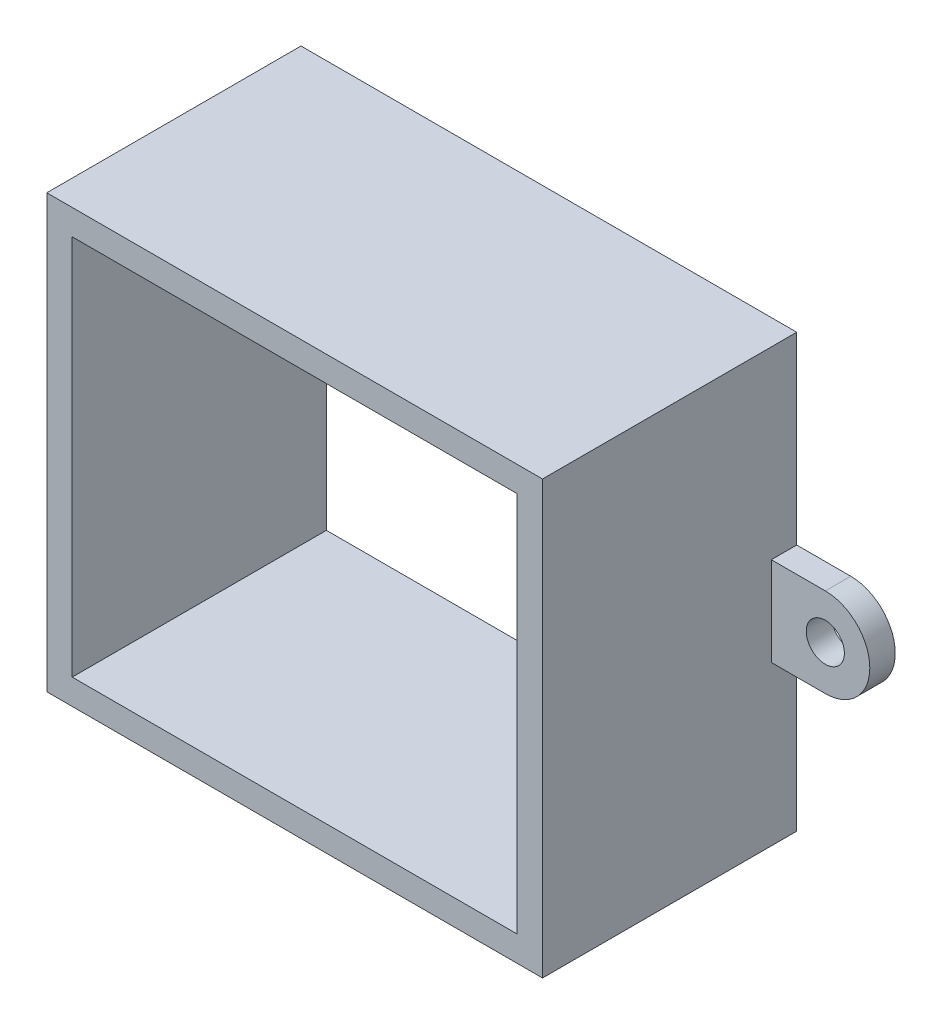
ISO-10303-21;
HEADER;
FILE_DESCRIPTION(('STEP AP214'),'2;1');
FILE_NAME('part.step','',(''),(''),'','','');
FILE_SCHEMA(('AUTOMOTIVE_DESIGN { 1 0 10303 214 1 1 1 1 }'));
ENDSEC;
DATA;
#1=APPLICATION_CONTEXT('core data for automotive mechanical design processes');
#2=APPLICATION_PROTOCOL_DEFINITION('international standard','automotive_design',2000,#1);
#3=PRODUCT_CONTEXT('',#1,'mechanical');
#4=PRODUCT('Part','Part','',(#3));
#5=PRODUCT_RELATED_PRODUCT_CATEGORY('part','',(#4));
#6=PRODUCT_DEFINITION_FORMATION('','',#4);
#7=PRODUCT_DEFINITION_CONTEXT('part definition',#1,'design');
#8=PRODUCT_DEFINITION('design','',#6,#7);
#9=PRODUCT_DEFINITION_SHAPE('','',#8);
#10=(LENGTH_UNIT() NAMED_UNIT(*) SI_UNIT(.MILLI.,.METRE.));
#11=(NAMED_UNIT(*) PLANE_ANGLE_UNIT() SI_UNIT($,.RADIAN.));
#12=(NAMED_UNIT(*) SI_UNIT($,.STERADIAN.) SOLID_ANGLE_UNIT());
#13=UNCERTAINTY_MEASURE_WITH_UNIT(LENGTH_MEASURE(1.E-05),#10,'distance_accuracy_value','');
#14=(GEOMETRIC_REPRESENTATION_CONTEXT(3) GLOBAL_UNCERTAINTY_ASSIGNED_CONTEXT((#13)) GLOBAL_UNIT_ASSIGNED_CONTEXT((#10,
#11,#12)) REPRESENTATION_CONTEXT('',''));
#15=CARTESIAN_POINT('',(0.,0.,0.));
#16=DIRECTION('',(0.,0.,1.));
#17=DIRECTION('',(1.,0.,0.));
#18=AXIS2_PLACEMENT_3D('',#15,#16,#17);
#19=CARTESIAN_POINT('',(-2.,-31.0544624151342,20.));
#20=DIRECTION('',(1.,0.,0.));
#21=DIRECTION('',(0.,0.,-1.));
#22=AXIS2_PLACEMENT_3D('',#19,#20,#21);
#23=PLANE('',#22);
#24=DIRECTION('',(0.,0.,-1.));
#25=VECTOR('',#24,1.);
#26=CARTESIAN_POINT('',(-2.,17.5,2.));
#27=LINE('',#26,#25);
#28=CARTESIAN_POINT('',(-2.,17.5,2.));
#29=VERTEX_POINT('',#28);
#30=CARTESIAN_POINT('',(-2.,17.5,0.));
#31=VERTEX_POINT('',#30);
#32=EDGE_CURVE('E341',#29,#31,#27,.T.);
#33=ORIENTED_EDGE('',*,*,#32,.F.);
#34=DIRECTION('',(0.,1.,0.));
#35=VECTOR('',#34,1.);
#36=CARTESIAN_POINT('',(-1.99999999999998,-31.0544624151342,2.));
#37=LINE('',#36,#35);
#38=CARTESIAN_POINT('',(-2.,10.5,2.));
#39=VERTEX_POINT('',#38);
#40=EDGE_CURVE('E527',#39,#29,#37,.T.);
#41=ORIENTED_EDGE('',*,*,#40,.F.);
#42=DIRECTION('',(0.,0.,-1.));
#43=VECTOR('',#42,1.);
#44=CARTESIAN_POINT('',(-2.,10.5,2.));
#45=LINE('',#44,#43);
#46=CARTESIAN_POINT('',(-2.,10.5,0.));
#47=VERTEX_POINT('',#46);
#48=EDGE_CURVE('E542',#39,#47,#45,.T.);
#49=ORIENTED_EDGE('',*,*,#48,.T.);
#50=DIRECTION('',(0.,-1.,0.));
#51=VECTOR('',#50,1.);
#52=CARTESIAN_POINT('',(-2.,-31.0544624151342,0.));
#53=LINE('',#52,#51);
#54=CARTESIAN_POINT('',(-1.99999999999999,-2.,0.));
#55=VERTEX_POINT('',#54);
#56=EDGE_CURVE('E215',#47,#55,#53,.T.);
#57=ORIENTED_EDGE('',*,*,#56,.T.);
#58=DIRECTION('',(0.,0.,-1.));
#59=VECTOR('',#58,1.);
#60=CARTESIAN_POINT('',(-1.99999999999999,-2.,20.));
#61=LINE('',#60,#59);
#62=CARTESIAN_POINT('',(-1.99999999999999,-2.,20.));
#63=VERTEX_POINT('',#62);
#64=EDGE_CURVE('E239',#63,#55,#61,.T.);
#65=ORIENTED_EDGE('',*,*,#64,.F.);
#66=DIRECTION('',(0.,-1.,0.));
#67=VECTOR('',#66,1.);
#68=CARTESIAN_POINT('',(-2.,-31.0544624151342,20.));
#69=LINE('',#68,#67);
#70=CARTESIAN_POINT('',(-2.,32.,20.));
#71=VERTEX_POINT('',#70);
#72=EDGE_CURVE('E275',#71,#63,#69,.T.);
#73=ORIENTED_EDGE('',*,*,#72,.F.);
#74=DIRECTION('',(0.,0.,-1.));
#75=VECTOR('',#74,1.);
#76=CARTESIAN_POINT('',(-2.,32.,20.));
#77=LINE('',#76,#75);
#78=CARTESIAN_POINT('',(-2.,32.,0.));
#79=VERTEX_POINT('',#78);
#80=EDGE_CURVE('E44',#71,#79,#77,.T.);
#81=ORIENTED_EDGE('',*,*,#80,.T.);
#82=EDGE_CURVE('E224',#79,#31,#53,.T.);
#83=ORIENTED_EDGE('',*,*,#82,.T.);
#84=EDGE_LOOP('',(#33,#41,#49,#57,#65,#73,#81,#83));
#85=FACE_BOUND('',#84,.T.);
#86=ADVANCED_FACE('F35',(#85),#23,.F.);
#87=CARTESIAN_POINT('',(37.,-31.0544624151342,20.));
#88=DIRECTION('',(1.,0.,0.));
#89=DIRECTION('',(0.,0.,-1.));
#90=AXIS2_PLACEMENT_3D('',#87,#88,#89);
#91=PLANE('',#90);
#92=DIRECTION('',(0.,0.,-1.));
#93=VECTOR('',#92,1.);
#94=CARTESIAN_POINT('',(37.,10.5,2.));
#95=LINE('',#94,#93);
#96=CARTESIAN_POINT('',(37.,10.5,2.));
#97=VERTEX_POINT('',#96);
#98=CARTESIAN_POINT('',(37.,10.5,0.));
#99=VERTEX_POINT('',#98);
#100=EDGE_CURVE('E186',#97,#99,#95,.T.);
#101=ORIENTED_EDGE('',*,*,#100,.F.);
#102=DIRECTION('',(0.,1.,0.));
#103=VECTOR('',#102,1.);
#104=CARTESIAN_POINT('',(37.,-31.0544624151341,2.));
#105=LINE('',#104,#103);
#106=CARTESIAN_POINT('',(37.,17.5,2.));
#107=VERTEX_POINT('',#106);
#108=EDGE_CURVE('E166',#97,#107,#105,.T.);
#109=ORIENTED_EDGE('',*,*,#108,.T.);
#110=DIRECTION('',(0.,0.,-1.));
#111=VECTOR('',#110,1.);
#112=CARTESIAN_POINT('',(37.,17.5,2.));
#113=LINE('',#112,#111);
#114=CARTESIAN_POINT('',(37.,17.5,0.));
#115=VERTEX_POINT('',#114);
#116=EDGE_CURVE('E160',#107,#115,#113,.T.);
#117=ORIENTED_EDGE('',*,*,#116,.T.);
#118=DIRECTION('',(0.,-1.,0.));
#119=VECTOR('',#118,1.);
#120=CARTESIAN_POINT('',(37.,-31.0544624151342,0.));
#121=LINE('',#120,#119);
#122=CARTESIAN_POINT('',(37.,32.,0.));
#123=VERTEX_POINT('',#122);
#124=EDGE_CURVE('E204',#123,#115,#121,.T.);
#125=ORIENTED_EDGE('',*,*,#124,.F.);
#126=DIRECTION('',(0.,0.,-1.));
#127=VECTOR('',#126,1.);
#128=CARTESIAN_POINT('',(37.,32.,20.));
#129=LINE('',#128,#127);
#130=CARTESIAN_POINT('',(37.,32.,20.));
#131=VERTEX_POINT('',#130);
#132=EDGE_CURVE('E11',#131,#123,#129,.T.);
#133=ORIENTED_EDGE('',*,*,#132,.F.);
#134=DIRECTION('',(0.,-1.,0.));
#135=VECTOR('',#134,1.);
#136=CARTESIAN_POINT('',(37.,-31.0544624151342,20.));
#137=LINE('',#136,#135);
#138=CARTESIAN_POINT('',(37.,-2.,20.));
#139=VERTEX_POINT('',#138);
#140=EDGE_CURVE('E249',#131,#139,#137,.T.);
#141=ORIENTED_EDGE('',*,*,#140,.T.);
#142=DIRECTION('',(0.,0.,-1.));
#143=VECTOR('',#142,1.);
#144=CARTESIAN_POINT('',(37.,-2.,20.));
#145=LINE('',#144,#143);
#146=CARTESIAN_POINT('',(37.,-2.,0.));
#147=VERTEX_POINT('',#146);
#148=EDGE_CURVE('E229',#139,#147,#145,.T.);
#149=ORIENTED_EDGE('',*,*,#148,.T.);
#150=EDGE_CURVE('E201',#99,#147,#121,.T.);
#151=ORIENTED_EDGE('',*,*,#150,.F.);
#152=EDGE_LOOP('',(#101,#109,#117,#125,#133,#141,#149,#151));
#153=FACE_BOUND('',#152,.T.);
#154=ADVANCED_FACE('F247',(#153),#91,.T.);
#155=CARTESIAN_POINT('',(17.4977780039393,32.,20.));
#156=DIRECTION('',(0.,1.,0.));
#157=DIRECTION('',(0.,0.,1.));
#158=AXIS2_PLACEMENT_3D('',#155,#156,#157);
#159=PLANE('',#158);
#160=DIRECTION('',(1.,0.,0.));
#161=VECTOR('',#160,1.);
#162=CARTESIAN_POINT('',(17.4977780039393,32.,0.));
#163=LINE('',#162,#161);
#164=EDGE_CURVE('E211',#79,#123,#163,.T.);
#165=ORIENTED_EDGE('',*,*,#164,.F.);
#166=ORIENTED_EDGE('',*,*,#80,.F.);
#167=DIRECTION('',(1.,0.,0.));
#168=VECTOR('',#167,1.);
#169=CARTESIAN_POINT('',(17.4977780039393,32.,20.));
#170=LINE('',#169,#168);
#171=EDGE_CURVE('E272',#71,#131,#170,.T.);
#172=ORIENTED_EDGE('',*,*,#171,.T.);
#173=ORIENTED_EDGE('',*,*,#132,.T.);
#174=EDGE_LOOP('',(#165,#166,#172,#173));
#175=FACE_BOUND('',#174,.T.);
#176=ADVANCED_FACE('F319',(#175),#159,.T.);
#177=CARTESIAN_POINT('',(35.,-31.0544624151342,20.));
#178=DIRECTION('',(-1.,0.,0.));
#179=DIRECTION('',(0.,0.,1.));
#180=AXIS2_PLACEMENT_3D('',#177,#178,#179);
#181=PLANE('',#180);
#182=DIRECTION('',(0.,1.,0.));
#183=VECTOR('',#182,1.);
#184=CARTESIAN_POINT('',(35.,-31.0544624151342,0.));
#185=LINE('',#184,#183);
#186=CARTESIAN_POINT('',(35.,0.,0.));
#187=VERTEX_POINT('',#186);
#188=CARTESIAN_POINT('',(35.,30.,0.));
#189=VERTEX_POINT('',#188);
#190=EDGE_CURVE('E279',#187,#189,#185,.T.);
#191=ORIENTED_EDGE('',*,*,#190,.F.);
#192=DIRECTION('',(0.,0.,-1.));
#193=VECTOR('',#192,1.);
#194=CARTESIAN_POINT('',(35.,0.,20.));
#195=LINE('',#194,#193);
#196=CARTESIAN_POINT('',(35.,0.,20.));
#197=VERTEX_POINT('',#196);
#198=EDGE_CURVE('E227',#197,#187,#195,.T.);
#199=ORIENTED_EDGE('',*,*,#198,.F.);
#200=DIRECTION('',(0.,1.,0.));
#201=VECTOR('',#200,1.);
#202=CARTESIAN_POINT('',(35.,-31.0544624151342,20.));
#203=LINE('',#202,#201);
#204=CARTESIAN_POINT('',(35.,30.,20.));
#205=VERTEX_POINT('',#204);
#206=EDGE_CURVE('E255',#197,#205,#203,.T.);
#207=ORIENTED_EDGE('',*,*,#206,.T.);
#208=DIRECTION('',(0.,0.,-1.));
#209=VECTOR('',#208,1.);
#210=CARTESIAN_POINT('',(35.,30.,20.));
#211=LINE('',#210,#209);
#212=EDGE_CURVE('E235',#205,#189,#211,.T.);
#213=ORIENTED_EDGE('',*,*,#212,.T.);
#214=EDGE_LOOP('',(#191,#199,#207,#213));
#215=FACE_BOUND('',#214,.T.);
#216=ADVANCED_FACE('F37',(#215),#181,.T.);
#217=CARTESIAN_POINT('',(17.4977780039393,0.,20.));
#218=DIRECTION('',(0.,1.,0.));
#219=DIRECTION('',(0.,0.,1.));
#220=AXIS2_PLACEMENT_3D('',#217,#218,#219);
#221=PLANE('',#220);
#222=DIRECTION('',(1.,0.,0.));
#223=VECTOR('',#222,1.);
#224=CARTESIAN_POINT('',(17.4977780039393,0.,0.));
#225=LINE('',#224,#223);
#226=CARTESIAN_POINT('',(0.,0.,0.));
#227=VERTEX_POINT('',#226);
#228=EDGE_CURVE('E282',#227,#187,#225,.T.);
#229=ORIENTED_EDGE('',*,*,#228,.F.);
#230=DIRECTION('',(0.,0.,-1.));
#231=VECTOR('',#230,1.);
#232=CARTESIAN_POINT('',(0.,0.,20.));
#233=LINE('',#232,#231);
#234=CARTESIAN_POINT('',(0.,0.,20.));
#235=VERTEX_POINT('',#234);
#236=EDGE_CURVE('E230',#235,#227,#233,.T.);
#237=ORIENTED_EDGE('',*,*,#236,.F.);
#238=DIRECTION('',(1.,0.,0.));
#239=VECTOR('',#238,1.);
#240=CARTESIAN_POINT('',(17.4977780039393,0.,20.));
#241=LINE('',#240,#239);
#242=EDGE_CURVE('E257',#235,#197,#241,.T.);
#243=ORIENTED_EDGE('',*,*,#242,.T.);
#244=ORIENTED_EDGE('',*,*,#198,.T.);
#245=EDGE_LOOP('',(#229,#237,#243,#244));
#246=FACE_BOUND('',#245,.T.);
#247=ADVANCED_FACE('F303',(#246),#221,.T.);
#248=CARTESIAN_POINT('',(0.,-31.0544624151342,20.));
#249=DIRECTION('',(-1.,0.,0.));
#250=DIRECTION('',(0.,-1.,0.));
#251=AXIS2_PLACEMENT_3D('',#248,#249,#250);
#252=PLANE('',#251);
#253=DIRECTION('',(0.,1.,0.));
#254=VECTOR('',#253,1.);
#255=CARTESIAN_POINT('',(0.,-31.0544624151342,0.));
#256=LINE('',#255,#254);
#257=CARTESIAN_POINT('',(0.,30.,0.));
#258=VERTEX_POINT('',#257);
#259=EDGE_CURVE('E284',#227,#258,#256,.T.);
#260=ORIENTED_EDGE('',*,*,#259,.T.);
#261=DIRECTION('',(0.,0.,-1.));
#262=VECTOR('',#261,1.);
#263=CARTESIAN_POINT('',(0.,30.,20.));
#264=LINE('',#263,#262);
#265=CARTESIAN_POINT('',(0.,30.,20.));
#266=VERTEX_POINT('',#265);
#267=EDGE_CURVE('E232',#266,#258,#264,.T.);
#268=ORIENTED_EDGE('',*,*,#267,.F.);
#269=DIRECTION('',(0.,1.,0.));
#270=VECTOR('',#269,1.);
#271=CARTESIAN_POINT('',(0.,-31.0544624151342,20.));
#272=LINE('',#271,#270);
#273=EDGE_CURVE('E262',#235,#266,#272,.T.);
#274=ORIENTED_EDGE('',*,*,#273,.F.);
#275=ORIENTED_EDGE('',*,*,#236,.T.);
#276=EDGE_LOOP('',(#260,#268,#274,#275));
#277=FACE_BOUND('',#276,.T.);
#278=ADVANCED_FACE('F305',(#277),#252,.F.);
#279=CARTESIAN_POINT('',(17.4977780039393,30.,20.));
#280=DIRECTION('',(0.,1.,0.));
#281=DIRECTION('',(0.,0.,1.));
#282=AXIS2_PLACEMENT_3D('',#279,#280,#281);
#283=PLANE('',#282);
#284=DIRECTION('',(1.,0.,0.));
#285=VECTOR('',#284,1.);
#286=CARTESIAN_POINT('',(17.4977780039393,30.,0.));
#287=LINE('',#286,#285);
#288=EDGE_CURVE('E205',#258,#189,#287,.T.);
#289=ORIENTED_EDGE('',*,*,#288,.T.);
#290=ORIENTED_EDGE('',*,*,#212,.F.);
#291=DIRECTION('',(1.,0.,0.));
#292=VECTOR('',#291,1.);
#293=CARTESIAN_POINT('',(17.4977780039393,30.,20.));
#294=LINE('',#293,#292);
#295=EDGE_CURVE('E269',#266,#205,#294,.T.);
#296=ORIENTED_EDGE('',*,*,#295,.F.);
#297=ORIENTED_EDGE('',*,*,#267,.T.);
#298=EDGE_LOOP('',(#289,#290,#296,#297));
#299=FACE_BOUND('',#298,.T.);
#300=ADVANCED_FACE('F292',(#299),#283,.F.);
#301=CARTESIAN_POINT('',(17.4977780039393,-2.,20.));
#302=DIRECTION('',(0.,1.,0.));
#303=DIRECTION('',(0.,0.,1.));
#304=AXIS2_PLACEMENT_3D('',#301,#302,#303);
#305=PLANE('',#304);
#306=DIRECTION('',(1.,0.,0.));
#307=VECTOR('',#306,1.);
#308=CARTESIAN_POINT('',(17.4977780039393,-2.,0.));
#309=LINE('',#308,#307);
#310=EDGE_CURVE('E218',#55,#147,#309,.T.);
#311=ORIENTED_EDGE('',*,*,#310,.T.);
#312=ORIENTED_EDGE('',*,*,#148,.F.);
#313=DIRECTION('',(1.,0.,0.));
#314=VECTOR('',#313,1.);
#315=CARTESIAN_POINT('',(17.4977780039393,-2.,20.));
#316=LINE('',#315,#314);
#317=EDGE_CURVE('E236',#63,#139,#316,.T.);
#318=ORIENTED_EDGE('',*,*,#317,.F.);
#319=ORIENTED_EDGE('',*,*,#64,.T.);
#320=EDGE_LOOP('',(#311,#312,#318,#319));
#321=FACE_BOUND('',#320,.T.);
#322=ADVANCED_FACE('F252',(#321),#305,.F.);
#323=CARTESIAN_POINT('',(17.4977780039393,-31.0544624151342,20.));
#324=DIRECTION('',(0.,0.,1.));
#325=DIRECTION('',(1.,0.,0.));
#326=AXIS2_PLACEMENT_3D('',#323,#324,#325);
#327=PLANE('',#326);
#328=ORIENTED_EDGE('',*,*,#206,.F.);
#329=ORIENTED_EDGE('',*,*,#242,.F.);
#330=ORIENTED_EDGE('',*,*,#273,.T.);
#331=ORIENTED_EDGE('',*,*,#295,.T.);
#332=EDGE_LOOP('',(#328,#329,#330,#331));
#333=FACE_BOUND('',#332,.T.);
#334=ORIENTED_EDGE('',*,*,#140,.F.);
#335=ORIENTED_EDGE('',*,*,#171,.F.);
#336=ORIENTED_EDGE('',*,*,#72,.T.);
#337=ORIENTED_EDGE('',*,*,#317,.T.);
#338=EDGE_LOOP('',(#334,#335,#336,#337));
#339=FACE_BOUND('',#338,.T.);
#340=ADVANCED_FACE('F301',(#333,#339),#327,.T.);
#341=CARTESIAN_POINT('',(17.4977780039393,-31.0544624151342,0.));
#342=DIRECTION('',(0.,0.,1.));
#343=DIRECTION('',(1.,0.,0.));
#344=AXIS2_PLACEMENT_3D('',#341,#342,#343);
#345=PLANE('',#344);
#346=ORIENTED_EDGE('',*,*,#190,.T.);
#347=ORIENTED_EDGE('',*,*,#288,.F.);
#348=ORIENTED_EDGE('',*,*,#259,.F.);
#349=ORIENTED_EDGE('',*,*,#228,.T.);
#350=EDGE_LOOP('',(#346,#347,#348,#349));
#351=FACE_BOUND('',#350,.T.);
#352=ORIENTED_EDGE('',*,*,#124,.T.);
#353=DIRECTION('',(-1.,0.,0.));
#354=VECTOR('',#353,1.);
#355=CARTESIAN_POINT('',(17.4977780039394,17.5,0.));
#356=LINE('',#355,#354);
#357=CARTESIAN_POINT('',(41.25,17.5,0.));
#358=VERTEX_POINT('',#357);
#359=EDGE_CURVE('E52',#358,#115,#356,.T.);
#360=ORIENTED_EDGE('',*,*,#359,.F.);
#361=CARTESIAN_POINT('',(41.25,14.,0.));
#362=DIRECTION('',(0.,0.,1.));
#363=DIRECTION('',(1.,0.,0.));
#364=AXIS2_PLACEMENT_3D('',#361,#362,#363);
#365=CIRCLE('',#364,3.5);
#366=CARTESIAN_POINT('',(41.25,10.5,0.));
#367=VERTEX_POINT('',#366);
#368=EDGE_CURVE('E158',#358,#367,#365,.F.);
#369=ORIENTED_EDGE('',*,*,#368,.T.);
#370=DIRECTION('',(-1.,0.,0.));
#371=VECTOR('',#370,1.);
#372=CARTESIAN_POINT('',(17.4977780039394,10.5,0.));
#373=LINE('',#372,#371);
#374=EDGE_CURVE('E175',#367,#99,#373,.T.);
#375=ORIENTED_EDGE('',*,*,#374,.T.);
#376=ORIENTED_EDGE('',*,*,#150,.T.);
#377=ORIENTED_EDGE('',*,*,#310,.F.);
#378=ORIENTED_EDGE('',*,*,#56,.F.);
#379=DIRECTION('',(1.,0.,0.));
#380=VECTOR('',#379,1.);
#381=CARTESIAN_POINT('',(17.4977780039393,10.5,0.));
#382=LINE('',#381,#380);
#383=CARTESIAN_POINT('',(-6.25,10.5,0.));
#384=VERTEX_POINT('',#383);
#385=EDGE_CURVE('E60',#384,#47,#382,.T.);
#386=ORIENTED_EDGE('',*,*,#385,.F.);
#387=CARTESIAN_POINT('',(-6.25000000000001,14.,0.));
#388=DIRECTION('',(0.,0.,1.));
#389=DIRECTION('',(1.,0.,0.));
#390=AXIS2_PLACEMENT_3D('',#387,#388,#389);
#391=CIRCLE('',#390,3.5);
#392=CARTESIAN_POINT('',(-6.25000000000001,17.5,0.));
#393=VERTEX_POINT('',#392);
#394=EDGE_CURVE('E536',#393,#384,#391,.T.);
#395=ORIENTED_EDGE('',*,*,#394,.F.);
#396=DIRECTION('',(1.,0.,0.));
#397=VECTOR('',#396,1.);
#398=CARTESIAN_POINT('',(17.4977780039393,17.5,0.));
#399=LINE('',#398,#397);
#400=EDGE_CURVE('E339',#393,#31,#399,.T.);
#401=ORIENTED_EDGE('',*,*,#400,.T.);
#402=ORIENTED_EDGE('',*,*,#82,.F.);
#403=ORIENTED_EDGE('',*,*,#164,.T.);
#404=EDGE_LOOP('',(#352,#360,#369,#375,#376,#377,#378,#386,#395,#401,#402,#403));
#405=FACE_BOUND('',#404,.T.);
#406=CARTESIAN_POINT('',(-6.25000000000001,14.,0.));
#407=DIRECTION('',(0.,0.,1.));
#408=DIRECTION('',(1.,0.,0.));
#409=AXIS2_PLACEMENT_3D('',#406,#407,#408);
#410=CIRCLE('',#409,1.5);
#411=CARTESIAN_POINT('',(-4.75000000000001,14.,0.));
#412=VERTEX_POINT('',#411);
#413=EDGE_CURVE('E159',#412,#412,#410,.T.);
#414=ORIENTED_EDGE('',*,*,#413,.T.);
#415=EDGE_LOOP('',(#414));
#416=FACE_BOUND('',#415,.T.);
#417=CARTESIAN_POINT('',(41.25,14.,0.));
#418=DIRECTION('',(0.,0.,1.));
#419=DIRECTION('',(1.,0.,0.));
#420=AXIS2_PLACEMENT_3D('',#417,#418,#419);
#421=CIRCLE('',#420,1.5);
#422=CARTESIAN_POINT('',(42.75,14.,0.));
#423=VERTEX_POINT('',#422);
#424=EDGE_CURVE('E172',#423,#423,#421,.F.);
#425=ORIENTED_EDGE('',*,*,#424,.F.);
#426=EDGE_LOOP('',(#425));
#427=FACE_BOUND('',#426,.T.);
#428=ADVANCED_FACE('F296',(#351,#405,#416,#427),#345,.F.);
#429=CARTESIAN_POINT('',(17.4977780039393,17.5,2.));
#430=DIRECTION('',(0.,1.,0.));
#431=DIRECTION('',(-1.,0.,0.));
#432=AXIS2_PLACEMENT_3D('',#429,#430,#431);
#433=PLANE('',#432);
#434=ORIENTED_EDGE('',*,*,#400,.F.);
#435=DIRECTION('',(0.,0.,-1.));
#436=VECTOR('',#435,1.);
#437=CARTESIAN_POINT('',(-6.25000000000001,17.5,2.));
#438=LINE('',#437,#436);
#439=CARTESIAN_POINT('',(-6.25000000000001,17.5,2.));
#440=VERTEX_POINT('',#439);
#441=EDGE_CURVE('E265',#440,#393,#438,.T.);
#442=ORIENTED_EDGE('',*,*,#441,.F.);
#443=DIRECTION('',(1.,0.,0.));
#444=VECTOR('',#443,1.);
#445=CARTESIAN_POINT('',(17.4977780039393,17.5,2.));
#446=LINE('',#445,#444);
#447=EDGE_CURVE('E523',#440,#29,#446,.T.);
#448=ORIENTED_EDGE('',*,*,#447,.T.);
#449=ORIENTED_EDGE('',*,*,#32,.T.);
#450=EDGE_LOOP('',(#434,#442,#448,#449));
#451=FACE_BOUND('',#450,.T.);
#452=ADVANCED_FACE('F349',(#451),#433,.T.);
#453=CARTESIAN_POINT('',(-6.25000000000001,14.,2.));
#454=DIRECTION('',(0.,0.,-1.));
#455=DIRECTION('',(-1.,0.,0.));
#456=AXIS2_PLACEMENT_3D('',#453,#454,#455);
#457=CYLINDRICAL_SURFACE('',#456,3.5);
#458=ORIENTED_EDGE('',*,*,#394,.T.);
#459=DIRECTION('',(0.,0.,-1.));
#460=VECTOR('',#459,1.);
#461=CARTESIAN_POINT('',(-6.25,10.5,2.));
#462=LINE('',#461,#460);
#463=CARTESIAN_POINT('',(-6.25,10.5,2.));
#464=VERTEX_POINT('',#463);
#465=EDGE_CURVE('E540',#464,#384,#462,.T.);
#466=ORIENTED_EDGE('',*,*,#465,.F.);
#467=CARTESIAN_POINT('',(-6.25000000000001,14.,2.));
#468=DIRECTION('',(0.,0.,1.));
#469=DIRECTION('',(1.,0.,0.));
#470=AXIS2_PLACEMENT_3D('',#467,#468,#469);
#471=CIRCLE('',#470,3.5);
#472=EDGE_CURVE('E525',#440,#464,#471,.T.);
#473=ORIENTED_EDGE('',*,*,#472,.F.);
#474=ORIENTED_EDGE('',*,*,#441,.T.);
#475=EDGE_LOOP('',(#458,#466,#473,#474));
#476=FACE_BOUND('',#475,.T.);
#477=ADVANCED_FACE('F359',(#476),#457,.T.);
#478=CARTESIAN_POINT('',(17.4977780039393,10.5,2.));
#479=DIRECTION('',(0.,1.,0.));
#480=DIRECTION('',(-1.,0.,0.));
#481=AXIS2_PLACEMENT_3D('',#478,#479,#480);
#482=PLANE('',#481);
#483=ORIENTED_EDGE('',*,*,#385,.T.);
#484=ORIENTED_EDGE('',*,*,#48,.F.);
#485=DIRECTION('',(1.,0.,0.));
#486=VECTOR('',#485,1.);
#487=CARTESIAN_POINT('',(17.4977780039393,10.5,2.));
#488=LINE('',#487,#486);
#489=EDGE_CURVE('E529',#464,#39,#488,.T.);
#490=ORIENTED_EDGE('',*,*,#489,.F.);
#491=ORIENTED_EDGE('',*,*,#465,.T.);
#492=EDGE_LOOP('',(#483,#484,#490,#491));
#493=FACE_BOUND('',#492,.T.);
#494=ADVANCED_FACE('F355',(#493),#482,.F.);
#495=CARTESIAN_POINT('',(-6.25000000000001,14.,2.));
#496=DIRECTION('',(0.,0.,-1.));
#497=DIRECTION('',(-1.,0.,0.));
#498=AXIS2_PLACEMENT_3D('',#495,#496,#497);
#499=CYLINDRICAL_SURFACE('',#498,1.5);
#500=CARTESIAN_POINT('',(-6.25000000000001,14.,2.));
#501=DIRECTION('',(0.,0.,1.));
#502=DIRECTION('',(1.,0.,0.));
#503=AXIS2_PLACEMENT_3D('',#500,#501,#502);
#504=CIRCLE('',#503,1.5);
#505=CARTESIAN_POINT('',(-4.75000000000001,14.,2.));
#506=VERTEX_POINT('',#505);
#507=EDGE_CURVE('E519',#506,#506,#504,.T.);
#508=ORIENTED_EDGE('',*,*,#507,.T.);
#509=EDGE_LOOP('',(#508));
#510=FACE_BOUND('',#509,.T.);
#511=ORIENTED_EDGE('',*,*,#413,.F.);
#512=EDGE_LOOP('',(#511));
#513=FACE_BOUND('',#512,.T.);
#514=ADVANCED_FACE('F351',(#510,#513),#499,.F.);
#515=CARTESIAN_POINT('',(17.4977780039393,-31.0544624151342,2.));
#516=DIRECTION('',(0.,0.,1.));
#517=DIRECTION('',(1.,0.,0.));
#518=AXIS2_PLACEMENT_3D('',#515,#516,#517);
#519=PLANE('',#518);
#520=ORIENTED_EDGE('',*,*,#507,.F.);
#521=EDGE_LOOP('',(#520));
#522=FACE_BOUND('',#521,.T.);
#523=ORIENTED_EDGE('',*,*,#447,.F.);
#524=ORIENTED_EDGE('',*,*,#472,.T.);
#525=ORIENTED_EDGE('',*,*,#489,.T.);
#526=ORIENTED_EDGE('',*,*,#40,.T.);
#527=EDGE_LOOP('',(#523,#524,#525,#526));
#528=FACE_BOUND('',#527,.T.);
#529=ADVANCED_FACE('F354',(#522,#528),#519,.T.);
#530=CARTESIAN_POINT('',(41.25,14.,2.));
#531=DIRECTION('',(0.,0.,-1.));
#532=DIRECTION('',(-1.,0.,0.));
#533=AXIS2_PLACEMENT_3D('',#530,#531,#532);
#534=CYLINDRICAL_SURFACE('',#533,3.5);
#535=ORIENTED_EDGE('',*,*,#368,.F.);
#536=DIRECTION('',(0.,0.,-1.));
#537=VECTOR('',#536,1.);
#538=CARTESIAN_POINT('',(41.25,17.5,2.));
#539=LINE('',#538,#537);
#540=CARTESIAN_POINT('',(41.25,17.5,2.));
#541=VERTEX_POINT('',#540);
#542=EDGE_CURVE('E151',#541,#358,#539,.T.);
#543=ORIENTED_EDGE('',*,*,#542,.F.);
#544=CARTESIAN_POINT('',(41.25,14.,2.));
#545=DIRECTION('',(0.,0.,1.));
#546=DIRECTION('',(1.,0.,0.));
#547=AXIS2_PLACEMENT_3D('',#544,#545,#546);
#548=CIRCLE('',#547,3.5);
#549=CARTESIAN_POINT('',(41.25,10.5,2.));
#550=VERTEX_POINT('',#549);
#551=EDGE_CURVE('E155',#541,#550,#548,.F.);
#552=ORIENTED_EDGE('',*,*,#551,.T.);
#553=DIRECTION('',(0.,0.,-1.));
#554=VECTOR('',#553,1.);
#555=CARTESIAN_POINT('',(41.25,10.5,2.));
#556=LINE('',#555,#554);
#557=EDGE_CURVE('E183',#550,#367,#556,.T.);
#558=ORIENTED_EDGE('',*,*,#557,.T.);
#559=EDGE_LOOP('',(#535,#543,#552,#558));
#560=FACE_BOUND('',#559,.T.);
#561=ADVANCED_FACE('F153',(#560),#534,.T.);
#562=CARTESIAN_POINT('',(17.4977780039394,17.5,2.));
#563=DIRECTION('',(0.,-1.,0.));
#564=DIRECTION('',(1.,0.,0.));
#565=AXIS2_PLACEMENT_3D('',#562,#563,#564);
#566=PLANE('',#565);
#567=ORIENTED_EDGE('',*,*,#359,.T.);
#568=ORIENTED_EDGE('',*,*,#116,.F.);
#569=DIRECTION('',(-1.,0.,0.));
#570=VECTOR('',#569,1.);
#571=CARTESIAN_POINT('',(17.4977780039394,17.5,2.));
#572=LINE('',#571,#570);
#573=EDGE_CURVE('E162',#541,#107,#572,.T.);
#574=ORIENTED_EDGE('',*,*,#573,.F.);
#575=ORIENTED_EDGE('',*,*,#542,.T.);
#576=EDGE_LOOP('',(#567,#568,#574,#575));
#577=FACE_BOUND('',#576,.T.);
#578=ADVANCED_FACE('F163',(#577),#566,.F.);
#579=CARTESIAN_POINT('',(17.4977780039394,10.5,2.));
#580=DIRECTION('',(0.,-1.,0.));
#581=DIRECTION('',(1.,0.,0.));
#582=AXIS2_PLACEMENT_3D('',#579,#580,#581);
#583=PLANE('',#582);
#584=ORIENTED_EDGE('',*,*,#374,.F.);
#585=ORIENTED_EDGE('',*,*,#557,.F.);
#586=DIRECTION('',(-1.,0.,0.));
#587=VECTOR('',#586,1.);
#588=CARTESIAN_POINT('',(17.4977780039394,10.5,2.));
#589=LINE('',#588,#587);
#590=EDGE_CURVE('E171',#550,#97,#589,.T.);
#591=ORIENTED_EDGE('',*,*,#590,.T.);
#592=ORIENTED_EDGE('',*,*,#100,.T.);
#593=EDGE_LOOP('',(#584,#585,#591,#592));
#594=FACE_BOUND('',#593,.T.);
#595=ADVANCED_FACE('F373',(#594),#583,.T.);
#596=CARTESIAN_POINT('',(41.25,14.,2.));
#597=DIRECTION('',(0.,0.,-1.));
#598=DIRECTION('',(-1.,0.,0.));
#599=AXIS2_PLACEMENT_3D('',#596,#597,#598);
#600=CYLINDRICAL_SURFACE('',#599,1.5);
#601=CARTESIAN_POINT('',(41.25,14.,2.));
#602=DIRECTION('',(0.,0.,1.));
#603=DIRECTION('',(1.,0.,0.));
#604=AXIS2_PLACEMENT_3D('',#601,#602,#603);
#605=CIRCLE('',#604,1.5);
#606=CARTESIAN_POINT('',(42.75,14.,2.));
#607=VERTEX_POINT('',#606);
#608=EDGE_CURVE('E180',#607,#607,#605,.F.);
#609=ORIENTED_EDGE('',*,*,#608,.F.);
#610=EDGE_LOOP('',(#609));
#611=FACE_BOUND('',#610,.T.);
#612=ORIENTED_EDGE('',*,*,#424,.T.);
#613=EDGE_LOOP('',(#612));
#614=FACE_BOUND('',#613,.T.);
#615=ADVANCED_FACE('F376',(#611,#614),#600,.F.);
#616=CARTESIAN_POINT('',(17.4977780039393,-31.0544624151342,2.));
#617=DIRECTION('',(0.,0.,1.));
#618=DIRECTION('',(1.,0.,0.));
#619=AXIS2_PLACEMENT_3D('',#616,#617,#618);
#620=PLANE('',#619);
#621=ORIENTED_EDGE('',*,*,#551,.F.);
#622=ORIENTED_EDGE('',*,*,#573,.T.);
#623=ORIENTED_EDGE('',*,*,#108,.F.);
#624=ORIENTED_EDGE('',*,*,#590,.F.);
#625=EDGE_LOOP('',(#621,#622,#623,#624));
#626=FACE_BOUND('',#625,.T.);
#627=ORIENTED_EDGE('',*,*,#608,.T.);
#628=EDGE_LOOP('',(#627));
#629=FACE_BOUND('',#628,.T.);
#630=ADVANCED_FACE('F168',(#626,#629),#620,.T.);
#631=CLOSED_SHELL('',(#86,#154,#176,#216,#247,#278,#300,#322,#340,#428,#452,#477,#494,#514,#529,
#561,#578,#595,#615,#630));
#632=MANIFOLD_SOLID_BREP('B2',#631);
#633=ADVANCED_BREP_SHAPE_REPRESENTATION('',(#18,#632),#14);
#634=SHAPE_DEFINITION_REPRESENTATION(#9,#633);
ENDSEC;
END-ISO-10303-21;
